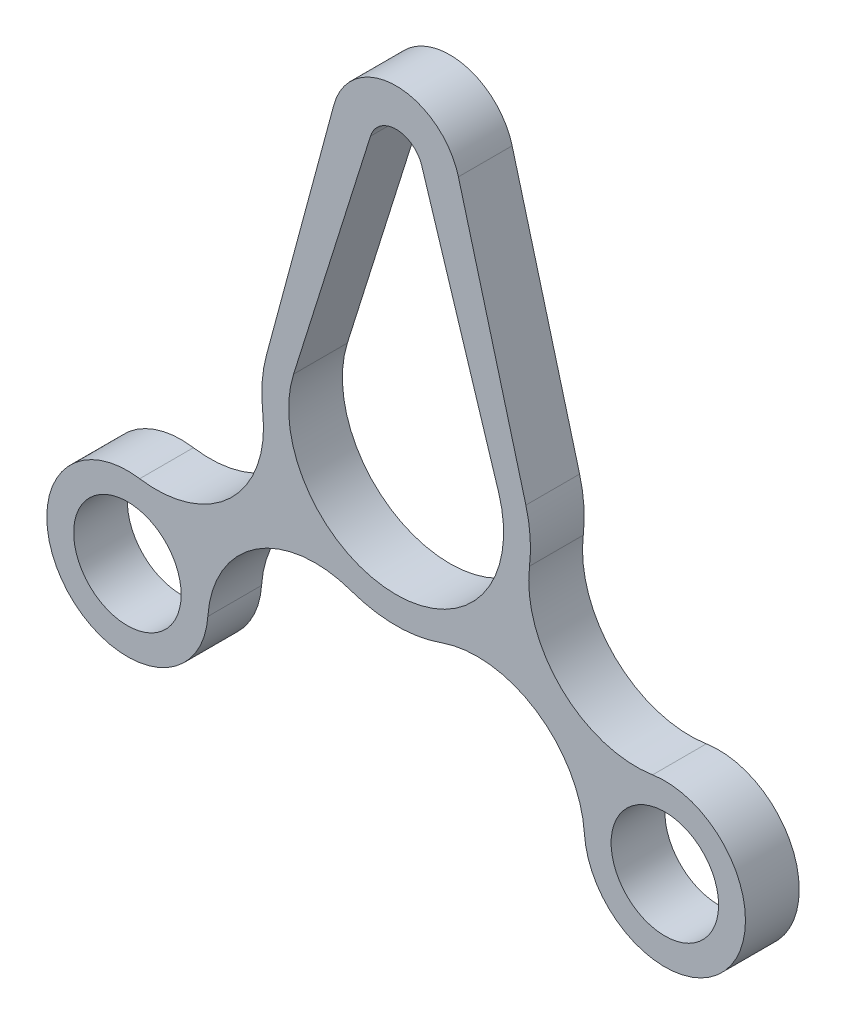
ISO-10303-21;
HEADER;
FILE_DESCRIPTION(('STEP AP214'),'2;1');
FILE_NAME('part.step','',(''),(''),'','','');
FILE_SCHEMA(('AUTOMOTIVE_DESIGN { 1 0 10303 214 1 1 1 1 }'));
ENDSEC;
DATA;
#1=APPLICATION_CONTEXT('core data for automotive mechanical design processes');
#2=APPLICATION_PROTOCOL_DEFINITION('international standard','automotive_design',2000,#1);
#3=PRODUCT_CONTEXT('',#1,'mechanical');
#4=PRODUCT('Part','Part','',(#3));
#5=PRODUCT_RELATED_PRODUCT_CATEGORY('part','',(#4));
#6=PRODUCT_DEFINITION_FORMATION('','',#4);
#7=PRODUCT_DEFINITION_CONTEXT('part definition',#1,'design');
#8=PRODUCT_DEFINITION('design','',#6,#7);
#9=PRODUCT_DEFINITION_SHAPE('','',#8);
#10=(LENGTH_UNIT() NAMED_UNIT(*) SI_UNIT(.MILLI.,.METRE.));
#11=(NAMED_UNIT(*) PLANE_ANGLE_UNIT() SI_UNIT($,.RADIAN.));
#12=(NAMED_UNIT(*) SI_UNIT($,.STERADIAN.) SOLID_ANGLE_UNIT());
#13=UNCERTAINTY_MEASURE_WITH_UNIT(LENGTH_MEASURE(1.E-05),#10,'distance_accuracy_value','');
#14=(GEOMETRIC_REPRESENTATION_CONTEXT(3) GLOBAL_UNCERTAINTY_ASSIGNED_CONTEXT((#13)) GLOBAL_UNIT_ASSIGNED_CONTEXT((#10,
#11,#12)) REPRESENTATION_CONTEXT('',''));
#15=CARTESIAN_POINT('',(0.,0.,0.));
#16=DIRECTION('',(0.,0.,1.));
#17=DIRECTION('',(1.,0.,0.));
#18=AXIS2_PLACEMENT_3D('',#15,#16,#17);
#19=CARTESIAN_POINT('',(44.6739033054664,-5.40762086816695,10.));
#20=DIRECTION('',(0.,0.,-1.));
#21=DIRECTION('',(-1.,0.,0.));
#22=AXIS2_PLACEMENT_3D('',#19,#20,#21);
#23=CYLINDRICAL_SURFACE('',#22,20.);
#24=CARTESIAN_POINT('',(44.6739033054664,-5.40762086816695,0.));
#25=DIRECTION('',(0.,0.,1.));
#26=DIRECTION('',(1.,0.,0.));
#27=AXIS2_PLACEMENT_3D('',#24,#25,#26);
#28=CIRCLE('',#27,20.);
#29=CARTESIAN_POINT('',(47.7173871309142,-25.1746946577858,0.));
#30=VERTEX_POINT('',#29);
#31=CARTESIAN_POINT('',(24.8188351697036,-3.00423381564831,0.));
#32=VERTEX_POINT('',#31);
#33=EDGE_CURVE('E208',#30,#32,#28,.F.);
#34=ORIENTED_EDGE('',*,*,#33,.T.);
#35=DIRECTION('',(0.,0.,-1.));
#36=VECTOR('',#35,1.);
#37=CARTESIAN_POINT('',(24.8188351697036,-3.00423381564831,10.));
#38=LINE('',#37,#36);
#39=CARTESIAN_POINT('',(24.8188351697036,-3.00423381564831,10.));
#40=VERTEX_POINT('',#39);
#41=EDGE_CURVE('E11',#40,#32,#38,.T.);
#42=ORIENTED_EDGE('',*,*,#41,.F.);
#43=CARTESIAN_POINT('',(44.6739033054664,-5.40762086816695,10.));
#44=DIRECTION('',(0.,0.,1.));
#45=DIRECTION('',(1.,0.,0.));
#46=AXIS2_PLACEMENT_3D('',#43,#44,#45);
#47=CIRCLE('',#46,20.);
#48=CARTESIAN_POINT('',(47.7173871309142,-25.1746946577858,10.));
#49=VERTEX_POINT('',#48);
#50=EDGE_CURVE('E287',#49,#40,#47,.F.);
#51=ORIENTED_EDGE('',*,*,#50,.F.);
#52=DIRECTION('',(0.,0.,-1.));
#53=VECTOR('',#52,1.);
#54=CARTESIAN_POINT('',(47.7173871309142,-25.1746946577858,10.));
#55=LINE('',#54,#53);
#56=EDGE_CURVE('E58',#49,#30,#55,.T.);
#57=ORIENTED_EDGE('',*,*,#56,.T.);
#58=EDGE_LOOP('',(#34,#42,#51,#57));
#59=FACE_BOUND('',#58,.T.);
#60=ADVANCED_FACE('F39',(#59),#23,.F.);
#61=CARTESIAN_POINT('',(0.,0.,10.));
#62=DIRECTION('',(0.,0.,-1.));
#63=DIRECTION('',(-1.,0.,0.));
#64=AXIS2_PLACEMENT_3D('',#61,#62,#63);
#65=CYLINDRICAL_SURFACE('',#64,25.);
#66=CARTESIAN_POINT('',(0.,0.,0.));
#67=DIRECTION('',(0.,0.,1.));
#68=DIRECTION('',(1.,0.,0.));
#69=AXIS2_PLACEMENT_3D('',#66,#67,#68);
#70=CIRCLE('',#69,25.);
#71=CARTESIAN_POINT('',(24.1402154091466,6.5,0.));
#72=VERTEX_POINT('',#71);
#73=EDGE_CURVE('E210',#32,#72,#70,.T.);
#74=ORIENTED_EDGE('',*,*,#73,.T.);
#75=DIRECTION('',(0.,0.,-1.));
#76=VECTOR('',#75,1.);
#77=CARTESIAN_POINT('',(24.1402154091466,6.5,10.));
#78=LINE('',#77,#76);
#79=CARTESIAN_POINT('',(24.1402154091466,6.5,10.));
#80=VERTEX_POINT('',#79);
#81=EDGE_CURVE('E49',#80,#72,#78,.T.);
#82=ORIENTED_EDGE('',*,*,#81,.F.);
#83=CARTESIAN_POINT('',(0.,0.,10.));
#84=DIRECTION('',(0.,0.,1.));
#85=DIRECTION('',(1.,0.,0.));
#86=AXIS2_PLACEMENT_3D('',#83,#84,#85);
#87=CIRCLE('',#86,25.);
#88=EDGE_CURVE('E294',#40,#80,#87,.T.);
#89=ORIENTED_EDGE('',*,*,#88,.F.);
#90=ORIENTED_EDGE('',*,*,#41,.T.);
#91=EDGE_LOOP('',(#74,#82,#89,#90));
#92=FACE_BOUND('',#91,.T.);
#93=ADVANCED_FACE('F333',(#92),#65,.T.);
#94=CARTESIAN_POINT('',(24.1402154091466,6.5,10.));
#95=DIRECTION('',(-0.965608616365865,-0.26,0.));
#96=DIRECTION('',(0.26,-0.965608616365865,0.));
#97=AXIS2_PLACEMENT_3D('',#94,#95,#96);
#98=PLANE('',#97);
#99=DIRECTION('',(-0.26,0.965608616365865,0.));
#100=VECTOR('',#99,1.);
#101=CARTESIAN_POINT('',(24.1402154091466,6.5,0.));
#102=LINE('',#101,#100);
#103=CARTESIAN_POINT('',(11.5873033963904,53.12,0.));
#104=VERTEX_POINT('',#103);
#105=EDGE_CURVE('E212',#72,#104,#102,.T.);
#106=ORIENTED_EDGE('',*,*,#105,.T.);
#107=DIRECTION('',(0.,0.,-1.));
#108=VECTOR('',#107,1.);
#109=CARTESIAN_POINT('',(11.5873033963904,53.12,10.));
#110=LINE('',#109,#108);
#111=CARTESIAN_POINT('',(11.5873033963904,53.12,10.));
#112=VERTEX_POINT('',#111);
#113=EDGE_CURVE('E257',#112,#104,#110,.T.);
#114=ORIENTED_EDGE('',*,*,#113,.F.);
#115=DIRECTION('',(-0.26,0.965608616365865,0.));
#116=VECTOR('',#115,1.);
#117=CARTESIAN_POINT('',(24.1402154091466,6.5,10.));
#118=LINE('',#117,#116);
#119=EDGE_CURVE('E296',#80,#112,#118,.T.);
#120=ORIENTED_EDGE('',*,*,#119,.F.);
#121=ORIENTED_EDGE('',*,*,#81,.T.);
#122=EDGE_LOOP('',(#106,#114,#120,#121));
#123=FACE_BOUND('',#122,.T.);
#124=ADVANCED_FACE('F338',(#123),#98,.F.);
#125=CARTESIAN_POINT('',(0.,50.,10.));
#126=DIRECTION('',(0.,0.,-1.));
#127=DIRECTION('',(-1.,0.,0.));
#128=AXIS2_PLACEMENT_3D('',#125,#126,#127);
#129=CYLINDRICAL_SURFACE('',#128,12.);
#130=CARTESIAN_POINT('',(0.,50.,0.));
#131=DIRECTION('',(0.,0.,1.));
#132=DIRECTION('',(1.,0.,0.));
#133=AXIS2_PLACEMENT_3D('',#130,#131,#132);
#134=CIRCLE('',#133,12.);
#135=CARTESIAN_POINT('',(-11.5873033963904,53.12,0.));
#136=VERTEX_POINT('',#135);
#137=EDGE_CURVE('E214',#104,#136,#134,.T.);
#138=ORIENTED_EDGE('',*,*,#137,.T.);
#139=DIRECTION('',(0.,0.,-1.));
#140=VECTOR('',#139,1.);
#141=CARTESIAN_POINT('',(-11.5873033963904,53.12,10.));
#142=LINE('',#141,#140);
#143=CARTESIAN_POINT('',(-11.5873033963904,53.12,10.));
#144=VERTEX_POINT('',#143);
#145=EDGE_CURVE('E255',#144,#136,#142,.T.);
#146=ORIENTED_EDGE('',*,*,#145,.F.);
#147=CARTESIAN_POINT('',(0.,50.,10.));
#148=DIRECTION('',(0.,0.,1.));
#149=DIRECTION('',(1.,0.,0.));
#150=AXIS2_PLACEMENT_3D('',#147,#148,#149);
#151=CIRCLE('',#150,12.);
#152=EDGE_CURVE('E298',#112,#144,#151,.T.);
#153=ORIENTED_EDGE('',*,*,#152,.F.);
#154=ORIENTED_EDGE('',*,*,#113,.T.);
#155=EDGE_LOOP('',(#138,#146,#153,#154));
#156=FACE_BOUND('',#155,.T.);
#157=ADVANCED_FACE('F371',(#156),#129,.T.);
#158=CARTESIAN_POINT('',(-24.1402154091466,6.5,10.));
#159=DIRECTION('',(-0.965608616365865,0.26,0.));
#160=DIRECTION('',(-0.26,-0.965608616365865,0.));
#161=AXIS2_PLACEMENT_3D('',#158,#159,#160);
#162=PLANE('',#161);
#163=DIRECTION('',(0.26,0.965608616365865,0.));
#164=VECTOR('',#163,1.);
#165=CARTESIAN_POINT('',(-24.1402154091466,6.5,0.));
#166=LINE('',#165,#164);
#167=CARTESIAN_POINT('',(-24.1402154091466,6.5,0.));
#168=VERTEX_POINT('',#167);
#169=EDGE_CURVE('E217',#168,#136,#166,.T.);
#170=ORIENTED_EDGE('',*,*,#169,.F.);
#171=DIRECTION('',(0.,0.,-1.));
#172=VECTOR('',#171,1.);
#173=CARTESIAN_POINT('',(-24.1402154091466,6.5,10.));
#174=LINE('',#173,#172);
#175=CARTESIAN_POINT('',(-24.1402154091466,6.5,10.));
#176=VERTEX_POINT('',#175);
#177=EDGE_CURVE('E253',#176,#168,#174,.T.);
#178=ORIENTED_EDGE('',*,*,#177,.F.);
#179=DIRECTION('',(0.26,0.965608616365865,0.));
#180=VECTOR('',#179,1.);
#181=CARTESIAN_POINT('',(-24.1402154091466,6.5,10.));
#182=LINE('',#181,#180);
#183=EDGE_CURVE('E300',#176,#144,#182,.T.);
#184=ORIENTED_EDGE('',*,*,#183,.T.);
#185=ORIENTED_EDGE('',*,*,#145,.T.);
#186=EDGE_LOOP('',(#170,#178,#184,#185));
#187=FACE_BOUND('',#186,.T.);
#188=ADVANCED_FACE('F367',(#187),#162,.T.);
#189=CARTESIAN_POINT('',(0.,0.,10.));
#190=DIRECTION('',(0.,0.,-1.));
#191=DIRECTION('',(-1.,0.,0.));
#192=AXIS2_PLACEMENT_3D('',#189,#190,#191);
#193=CYLINDRICAL_SURFACE('',#192,25.);
#194=CARTESIAN_POINT('',(0.,0.,0.));
#195=DIRECTION('',(0.,0.,1.));
#196=DIRECTION('',(1.,0.,0.));
#197=AXIS2_PLACEMENT_3D('',#194,#195,#196);
#198=CIRCLE('',#197,25.);
#199=CARTESIAN_POINT('',(-24.8188351697036,-3.0042338156483,0.));
#200=VERTEX_POINT('',#199);
#201=EDGE_CURVE('E220',#168,#200,#198,.T.);
#202=ORIENTED_EDGE('',*,*,#201,.T.);
#203=DIRECTION('',(0.,0.,-1.));
#204=VECTOR('',#203,1.);
#205=CARTESIAN_POINT('',(-24.8188351697036,-3.0042338156483,10.));
#206=LINE('',#205,#204);
#207=CARTESIAN_POINT('',(-24.8188351697036,-3.0042338156483,10.));
#208=VERTEX_POINT('',#207);
#209=EDGE_CURVE('E251',#208,#200,#206,.T.);
#210=ORIENTED_EDGE('',*,*,#209,.F.);
#211=CARTESIAN_POINT('',(0.,0.,10.));
#212=DIRECTION('',(0.,0.,1.));
#213=DIRECTION('',(1.,0.,0.));
#214=AXIS2_PLACEMENT_3D('',#211,#212,#213);
#215=CIRCLE('',#214,25.);
#216=EDGE_CURVE('E303',#176,#208,#215,.T.);
#217=ORIENTED_EDGE('',*,*,#216,.F.);
#218=ORIENTED_EDGE('',*,*,#177,.T.);
#219=EDGE_LOOP('',(#202,#210,#217,#218));
#220=FACE_BOUND('',#219,.T.);
#221=ADVANCED_FACE('F363',(#220),#193,.T.);
#222=CARTESIAN_POINT('',(-44.6739033054664,-5.40762086816695,10.));
#223=DIRECTION('',(0.,0.,-1.));
#224=DIRECTION('',(-1.,0.,0.));
#225=AXIS2_PLACEMENT_3D('',#222,#223,#224);
#226=CYLINDRICAL_SURFACE('',#225,20.);
#227=CARTESIAN_POINT('',(-44.6739033054664,-5.40762086816695,0.));
#228=DIRECTION('',(0.,0.,1.));
#229=DIRECTION('',(1.,0.,0.));
#230=AXIS2_PLACEMENT_3D('',#227,#228,#229);
#231=CIRCLE('',#230,20.);
#232=CARTESIAN_POINT('',(-47.7173871309142,-25.1746946577858,0.));
#233=VERTEX_POINT('',#232);
#234=EDGE_CURVE('E223',#233,#200,#231,.T.);
#235=ORIENTED_EDGE('',*,*,#234,.F.);
#236=DIRECTION('',(0.,0.,-1.));
#237=VECTOR('',#236,1.);
#238=CARTESIAN_POINT('',(-47.7173871309142,-25.1746946577858,10.));
#239=LINE('',#238,#237);
#240=CARTESIAN_POINT('',(-47.7173871309142,-25.1746946577858,10.));
#241=VERTEX_POINT('',#240);
#242=EDGE_CURVE('E249',#241,#233,#239,.T.);
#243=ORIENTED_EDGE('',*,*,#242,.F.);
#244=CARTESIAN_POINT('',(-44.6739033054664,-5.40762086816695,10.));
#245=DIRECTION('',(0.,0.,1.));
#246=DIRECTION('',(1.,0.,0.));
#247=AXIS2_PLACEMENT_3D('',#244,#245,#246);
#248=CIRCLE('',#247,20.);
#249=EDGE_CURVE('E305',#241,#208,#248,.T.);
#250=ORIENTED_EDGE('',*,*,#249,.T.);
#251=ORIENTED_EDGE('',*,*,#209,.T.);
#252=EDGE_LOOP('',(#235,#243,#250,#251));
#253=FACE_BOUND('',#252,.T.);
#254=ADVANCED_FACE('F360',(#253),#226,.F.);
#255=CARTESIAN_POINT('',(-50.,-40.,10.));
#256=DIRECTION('',(0.,0.,-1.));
#257=DIRECTION('',(-1.,0.,0.));
#258=AXIS2_PLACEMENT_3D('',#255,#256,#257);
#259=CYLINDRICAL_SURFACE('',#258,15.);
#260=CARTESIAN_POINT('',(-50.,-40.,0.));
#261=DIRECTION('',(0.,0.,1.));
#262=DIRECTION('',(1.,0.,0.));
#263=AXIS2_PLACEMENT_3D('',#260,#261,#262);
#264=CIRCLE('',#263,15.);
#265=CARTESIAN_POINT('',(-35.0352261095039,-41.0273959345487,0.));
#266=VERTEX_POINT('',#265);
#267=EDGE_CURVE('E226',#233,#266,#264,.T.);
#268=ORIENTED_EDGE('',*,*,#267,.T.);
#269=DIRECTION('',(0.,0.,-1.));
#270=VECTOR('',#269,1.);
#271=CARTESIAN_POINT('',(-35.0352261095039,-41.0273959345487,10.));
#272=LINE('',#271,#270);
#273=CARTESIAN_POINT('',(-35.0352261095039,-41.0273959345487,10.));
#274=VERTEX_POINT('',#273);
#275=EDGE_CURVE('E246',#274,#266,#272,.T.);
#276=ORIENTED_EDGE('',*,*,#275,.F.);
#277=CARTESIAN_POINT('',(-50.,-40.,10.));
#278=DIRECTION('',(0.,0.,1.));
#279=DIRECTION('',(1.,0.,0.));
#280=AXIS2_PLACEMENT_3D('',#277,#278,#279);
#281=CIRCLE('',#280,15.);
#282=EDGE_CURVE('E308',#241,#274,#281,.T.);
#283=ORIENTED_EDGE('',*,*,#282,.F.);
#284=ORIENTED_EDGE('',*,*,#242,.T.);
#285=EDGE_LOOP('',(#268,#276,#283,#284));
#286=FACE_BOUND('',#285,.T.);
#287=ADVANCED_FACE('F313',(#286),#259,.T.);
#288=CARTESIAN_POINT('',(-15.0821942555092,-42.3972571806135,10.));
#289=DIRECTION('',(0.,0.,-1.));
#290=DIRECTION('',(-1.,0.,0.));
#291=AXIS2_PLACEMENT_3D('',#288,#289,#290);
#292=CYLINDRICAL_SURFACE('',#291,20.);
#293=CARTESIAN_POINT('',(-15.0821942555092,-42.3972571806135,0.));
#294=DIRECTION('',(0.,0.,1.));
#295=DIRECTION('',(1.,0.,0.));
#296=AXIS2_PLACEMENT_3D('',#293,#294,#295);
#297=CIRCLE('',#296,20.);
#298=CARTESIAN_POINT('',(-8.3789968086162,-23.5540317670075,0.));
#299=VERTEX_POINT('',#298);
#300=EDGE_CURVE('E228',#266,#299,#297,.F.);
#301=ORIENTED_EDGE('',*,*,#300,.T.);
#302=DIRECTION('',(0.,0.,-1.));
#303=VECTOR('',#302,1.);
#304=CARTESIAN_POINT('',(-8.3789968086162,-23.5540317670075,10.));
#305=LINE('',#304,#303);
#306=CARTESIAN_POINT('',(-8.3789968086162,-23.5540317670075,10.));
#307=VERTEX_POINT('',#306);
#308=EDGE_CURVE('E181',#307,#299,#305,.T.);
#309=ORIENTED_EDGE('',*,*,#308,.F.);
#310=CARTESIAN_POINT('',(-15.0821942555092,-42.3972571806135,10.));
#311=DIRECTION('',(0.,0.,1.));
#312=DIRECTION('',(1.,0.,0.));
#313=AXIS2_PLACEMENT_3D('',#310,#311,#312);
#314=CIRCLE('',#313,20.);
#315=EDGE_CURVE('E169',#274,#307,#314,.F.);
#316=ORIENTED_EDGE('',*,*,#315,.F.);
#317=ORIENTED_EDGE('',*,*,#275,.T.);
#318=EDGE_LOOP('',(#301,#309,#316,#317));
#319=FACE_BOUND('',#318,.T.);
#320=ADVANCED_FACE('F317',(#319),#292,.F.);
#321=CARTESIAN_POINT('',(0.,0.,10.));
#322=DIRECTION('',(0.,0.,-1.));
#323=DIRECTION('',(-1.,0.,0.));
#324=AXIS2_PLACEMENT_3D('',#321,#322,#323);
#325=CYLINDRICAL_SURFACE('',#324,25.);
#326=CARTESIAN_POINT('',(0.,0.,0.));
#327=DIRECTION('',(0.,0.,1.));
#328=DIRECTION('',(1.,0.,0.));
#329=AXIS2_PLACEMENT_3D('',#326,#327,#328);
#330=CIRCLE('',#329,25.);
#331=CARTESIAN_POINT('',(8.3789968086162,-23.5540317670075,0.));
#332=VERTEX_POINT('',#331);
#333=EDGE_CURVE('E178',#299,#332,#330,.T.);
#334=ORIENTED_EDGE('',*,*,#333,.T.);
#335=DIRECTION('',(0.,0.,-1.));
#336=VECTOR('',#335,1.);
#337=CARTESIAN_POINT('',(8.3789968086162,-23.5540317670075,10.));
#338=LINE('',#337,#336);
#339=CARTESIAN_POINT('',(8.3789968086162,-23.5540317670075,10.));
#340=VERTEX_POINT('',#339);
#341=EDGE_CURVE('E175',#340,#332,#338,.T.);
#342=ORIENTED_EDGE('',*,*,#341,.F.);
#343=CARTESIAN_POINT('',(0.,0.,10.));
#344=DIRECTION('',(0.,0.,1.));
#345=DIRECTION('',(1.,0.,0.));
#346=AXIS2_PLACEMENT_3D('',#343,#344,#345);
#347=CIRCLE('',#346,25.);
#348=EDGE_CURVE('E160',#307,#340,#347,.T.);
#349=ORIENTED_EDGE('',*,*,#348,.F.);
#350=ORIENTED_EDGE('',*,*,#308,.T.);
#351=EDGE_LOOP('',(#334,#342,#349,#350));
#352=FACE_BOUND('',#351,.T.);
#353=ADVANCED_FACE('F176',(#352),#325,.T.);
#354=CARTESIAN_POINT('',(15.0821942555092,-42.3972571806135,10.));
#355=DIRECTION('',(0.,0.,-1.));
#356=DIRECTION('',(-1.,0.,0.));
#357=AXIS2_PLACEMENT_3D('',#354,#355,#356);
#358=CYLINDRICAL_SURFACE('',#357,20.);
#359=CARTESIAN_POINT('',(15.0821942555092,-42.3972571806135,0.));
#360=DIRECTION('',(0.,0.,1.));
#361=DIRECTION('',(1.,0.,0.));
#362=AXIS2_PLACEMENT_3D('',#359,#360,#361);
#363=CIRCLE('',#362,20.);
#364=CARTESIAN_POINT('',(35.0352261095039,-41.0273959345487,0.));
#365=VERTEX_POINT('',#364);
#366=EDGE_CURVE('E231',#365,#332,#363,.T.);
#367=ORIENTED_EDGE('',*,*,#366,.F.);
#368=DIRECTION('',(0.,0.,-1.));
#369=VECTOR('',#368,1.);
#370=CARTESIAN_POINT('',(35.0352261095039,-41.0273959345487,10.));
#371=LINE('',#370,#369);
#372=CARTESIAN_POINT('',(35.0352261095039,-41.0273959345487,10.));
#373=VERTEX_POINT('',#372);
#374=EDGE_CURVE('E108',#373,#365,#371,.T.);
#375=ORIENTED_EDGE('',*,*,#374,.F.);
#376=CARTESIAN_POINT('',(15.0821942555092,-42.3972571806135,10.));
#377=DIRECTION('',(0.,0.,1.));
#378=DIRECTION('',(1.,0.,0.));
#379=AXIS2_PLACEMENT_3D('',#376,#377,#378);
#380=CIRCLE('',#379,20.);
#381=EDGE_CURVE('E167',#373,#340,#380,.T.);
#382=ORIENTED_EDGE('',*,*,#381,.T.);
#383=ORIENTED_EDGE('',*,*,#341,.T.);
#384=EDGE_LOOP('',(#367,#375,#382,#383));
#385=FACE_BOUND('',#384,.T.);
#386=ADVANCED_FACE('F183',(#385),#358,.F.);
#387=CARTESIAN_POINT('',(0.,50.,10.));
#388=DIRECTION('',(0.,0.,-1.));
#389=DIRECTION('',(-1.,0.,0.));
#390=AXIS2_PLACEMENT_3D('',#387,#388,#389);
#391=CYLINDRICAL_SURFACE('',#390,5.);
#392=CARTESIAN_POINT('',(0.,50.,0.));
#393=DIRECTION('',(0.,0.,1.));
#394=DIRECTION('',(1.,0.,0.));
#395=AXIS2_PLACEMENT_3D('',#392,#393,#394);
#396=CIRCLE('',#395,5.);
#397=CARTESIAN_POINT('',(4.76969600708474,51.5,0.));
#398=VERTEX_POINT('',#397);
#399=CARTESIAN_POINT('',(-4.76969600708474,51.5,0.));
#400=VERTEX_POINT('',#399);
#401=EDGE_CURVE('E196',#398,#400,#396,.T.);
#402=ORIENTED_EDGE('',*,*,#401,.F.);
#403=DIRECTION('',(0.,0.,-1.));
#404=VECTOR('',#403,1.);
#405=CARTESIAN_POINT('',(4.76969600708474,51.5,10.));
#406=LINE('',#405,#404);
#407=CARTESIAN_POINT('',(4.76969600708474,51.5,10.));
#408=VERTEX_POINT('',#407);
#409=EDGE_CURVE('E43',#408,#398,#406,.T.);
#410=ORIENTED_EDGE('',*,*,#409,.F.);
#411=CARTESIAN_POINT('',(0.,50.,10.));
#412=DIRECTION('',(0.,0.,1.));
#413=DIRECTION('',(1.,0.,0.));
#414=AXIS2_PLACEMENT_3D('',#411,#412,#413);
#415=CIRCLE('',#414,5.);
#416=CARTESIAN_POINT('',(-4.76969600708474,51.5,10.));
#417=VERTEX_POINT('',#416);
#418=EDGE_CURVE('E242',#408,#417,#415,.T.);
#419=ORIENTED_EDGE('',*,*,#418,.T.);
#420=DIRECTION('',(0.,0.,-1.));
#421=VECTOR('',#420,1.);
#422=CARTESIAN_POINT('',(-4.76969600708474,51.5,10.));
#423=LINE('',#422,#421);
#424=EDGE_CURVE('E195',#417,#400,#423,.T.);
#425=ORIENTED_EDGE('',*,*,#424,.T.);
#426=EDGE_LOOP('',(#402,#410,#419,#425));
#427=FACE_BOUND('',#426,.T.);
#428=ADVANCED_FACE('F41',(#427),#391,.F.);
#429=CARTESIAN_POINT('',(19.0787840283389,6.,10.));
#430=DIRECTION('',(-0.953939201416946,-0.3,0.));
#431=DIRECTION('',(0.3,-0.953939201416946,0.));
#432=AXIS2_PLACEMENT_3D('',#429,#430,#431);
#433=PLANE('',#432);
#434=DIRECTION('',(-0.3,0.953939201416946,0.));
#435=VECTOR('',#434,1.);
#436=CARTESIAN_POINT('',(19.0787840283389,6.,0.));
#437=LINE('',#436,#435);
#438=CARTESIAN_POINT('',(19.0787840283389,6.,0.));
#439=VERTEX_POINT('',#438);
#440=EDGE_CURVE('E199',#439,#398,#437,.T.);
#441=ORIENTED_EDGE('',*,*,#440,.F.);
#442=DIRECTION('',(0.,0.,-1.));
#443=VECTOR('',#442,1.);
#444=CARTESIAN_POINT('',(19.0787840283389,6.,10.));
#445=LINE('',#444,#443);
#446=CARTESIAN_POINT('',(19.0787840283389,6.,10.));
#447=VERTEX_POINT('',#446);
#448=EDGE_CURVE('E264',#447,#439,#445,.T.);
#449=ORIENTED_EDGE('',*,*,#448,.F.);
#450=DIRECTION('',(-0.3,0.953939201416946,0.));
#451=VECTOR('',#450,1.);
#452=CARTESIAN_POINT('',(19.0787840283389,6.,10.));
#453=LINE('',#452,#451);
#454=EDGE_CURVE('E273',#447,#408,#453,.T.);
#455=ORIENTED_EDGE('',*,*,#454,.T.);
#456=ORIENTED_EDGE('',*,*,#409,.T.);
#457=EDGE_LOOP('',(#441,#449,#455,#456));
#458=FACE_BOUND('',#457,.T.);
#459=ADVANCED_FACE('F271',(#458),#433,.T.);
#460=CARTESIAN_POINT('',(0.,0.,10.));
#461=DIRECTION('',(0.,0.,-1.));
#462=DIRECTION('',(-1.,0.,0.));
#463=AXIS2_PLACEMENT_3D('',#460,#461,#462);
#464=CYLINDRICAL_SURFACE('',#463,20.);
#465=CARTESIAN_POINT('',(0.,0.,0.));
#466=DIRECTION('',(0.,0.,1.));
#467=DIRECTION('',(1.,0.,0.));
#468=AXIS2_PLACEMENT_3D('',#465,#466,#467);
#469=CIRCLE('',#468,20.);
#470=CARTESIAN_POINT('',(-19.0787840283389,6.,0.));
#471=VERTEX_POINT('',#470);
#472=EDGE_CURVE('E202',#471,#439,#469,.T.);
#473=ORIENTED_EDGE('',*,*,#472,.F.);
#474=DIRECTION('',(0.,0.,-1.));
#475=VECTOR('',#474,1.);
#476=CARTESIAN_POINT('',(-19.0787840283389,6.,10.));
#477=LINE('',#476,#475);
#478=CARTESIAN_POINT('',(-19.0787840283389,6.,10.));
#479=VERTEX_POINT('',#478);
#480=EDGE_CURVE('E263',#479,#471,#477,.T.);
#481=ORIENTED_EDGE('',*,*,#480,.F.);
#482=CARTESIAN_POINT('',(0.,0.,10.));
#483=DIRECTION('',(0.,0.,1.));
#484=DIRECTION('',(1.,0.,0.));
#485=AXIS2_PLACEMENT_3D('',#482,#483,#484);
#486=CIRCLE('',#485,20.);
#487=EDGE_CURVE('E282',#479,#447,#486,.T.);
#488=ORIENTED_EDGE('',*,*,#487,.T.);
#489=ORIENTED_EDGE('',*,*,#448,.T.);
#490=EDGE_LOOP('',(#473,#481,#488,#489));
#491=FACE_BOUND('',#490,.T.);
#492=ADVANCED_FACE('F279',(#491),#464,.F.);
#493=CARTESIAN_POINT('',(50.,-40.,10.));
#494=DIRECTION('',(0.,0.,-1.));
#495=DIRECTION('',(-1.,0.,0.));
#496=AXIS2_PLACEMENT_3D('',#493,#494,#495);
#497=CYLINDRICAL_SURFACE('',#496,10.);
#498=CARTESIAN_POINT('',(50.,-40.,10.));
#499=DIRECTION('',(0.,0.,1.));
#500=DIRECTION('',(1.,0.,0.));
#501=AXIS2_PLACEMENT_3D('',#498,#499,#500);
#502=CIRCLE('',#501,10.);
#503=CARTESIAN_POINT('',(60.,-40.,10.));
#504=VERTEX_POINT('',#503);
#505=EDGE_CURVE('E186',#504,#504,#502,.F.);
#506=ORIENTED_EDGE('',*,*,#505,.F.);
#507=EDGE_LOOP('',(#506));
#508=FACE_BOUND('',#507,.T.);
#509=CARTESIAN_POINT('',(50.,-40.,0.));
#510=DIRECTION('',(0.,0.,1.));
#511=DIRECTION('',(1.,0.,0.));
#512=AXIS2_PLACEMENT_3D('',#509,#510,#511);
#513=CIRCLE('',#512,10.);
#514=CARTESIAN_POINT('',(60.,-40.,0.));
#515=VERTEX_POINT('',#514);
#516=EDGE_CURVE('E236',#515,#515,#513,.F.);
#517=ORIENTED_EDGE('',*,*,#516,.T.);
#518=EDGE_LOOP('',(#517));
#519=FACE_BOUND('',#518,.T.);
#520=ADVANCED_FACE('F321',(#508,#519),#497,.F.);
#521=CARTESIAN_POINT('',(50.,-40.,10.));
#522=DIRECTION('',(0.,0.,-1.));
#523=DIRECTION('',(-1.,0.,0.));
#524=AXIS2_PLACEMENT_3D('',#521,#522,#523);
#525=CYLINDRICAL_SURFACE('',#524,15.);
#526=CARTESIAN_POINT('',(50.,-40.,0.));
#527=DIRECTION('',(0.,0.,1.));
#528=DIRECTION('',(1.,0.,0.));
#529=AXIS2_PLACEMENT_3D('',#526,#527,#528);
#530=CIRCLE('',#529,15.);
#531=EDGE_CURVE('E233',#30,#365,#530,.F.);
#532=ORIENTED_EDGE('',*,*,#531,.F.);
#533=ORIENTED_EDGE('',*,*,#56,.F.);
#534=CARTESIAN_POINT('',(50.,-40.,10.));
#535=DIRECTION('',(0.,0.,1.));
#536=DIRECTION('',(1.,0.,0.));
#537=AXIS2_PLACEMENT_3D('',#534,#535,#536);
#538=CIRCLE('',#537,15.);
#539=EDGE_CURVE('E184',#49,#373,#538,.F.);
#540=ORIENTED_EDGE('',*,*,#539,.T.);
#541=ORIENTED_EDGE('',*,*,#374,.T.);
#542=EDGE_LOOP('',(#532,#533,#540,#541));
#543=FACE_BOUND('',#542,.T.);
#544=ADVANCED_FACE('F319',(#543),#525,.T.);
#545=CARTESIAN_POINT('',(-19.0787840283389,6.,10.));
#546=DIRECTION('',(-0.953939201416946,0.3,0.));
#547=DIRECTION('',(-0.3,-0.953939201416946,0.));
#548=AXIS2_PLACEMENT_3D('',#545,#546,#547);
#549=PLANE('',#548);
#550=DIRECTION('',(0.3,0.953939201416946,0.));
#551=VECTOR('',#550,1.);
#552=CARTESIAN_POINT('',(-19.0787840283389,6.,0.));
#553=LINE('',#552,#551);
#554=EDGE_CURVE('E205',#471,#400,#553,.T.);
#555=ORIENTED_EDGE('',*,*,#554,.T.);
#556=ORIENTED_EDGE('',*,*,#424,.F.);
#557=DIRECTION('',(0.3,0.953939201416946,0.));
#558=VECTOR('',#557,1.);
#559=CARTESIAN_POINT('',(-19.0787840283389,6.,10.));
#560=LINE('',#559,#558);
#561=EDGE_CURVE('E284',#479,#417,#560,.T.);
#562=ORIENTED_EDGE('',*,*,#561,.F.);
#563=ORIENTED_EDGE('',*,*,#480,.T.);
#564=EDGE_LOOP('',(#555,#556,#562,#563));
#565=FACE_BOUND('',#564,.T.);
#566=ADVANCED_FACE('F285',(#565),#549,.F.);
#567=CARTESIAN_POINT('',(-50.,-40.,10.));
#568=DIRECTION('',(0.,0.,-1.));
#569=DIRECTION('',(-1.,0.,0.));
#570=AXIS2_PLACEMENT_3D('',#567,#568,#569);
#571=CYLINDRICAL_SURFACE('',#570,10.);
#572=CARTESIAN_POINT('',(-50.,-40.,10.));
#573=DIRECTION('',(0.,0.,1.));
#574=DIRECTION('',(1.,0.,0.));
#575=AXIS2_PLACEMENT_3D('',#572,#573,#574);
#576=CIRCLE('',#575,10.);
#577=CARTESIAN_POINT('',(-40.,-40.,10.));
#578=VERTEX_POINT('',#577);
#579=EDGE_CURVE('E192',#578,#578,#576,.T.);
#580=ORIENTED_EDGE('',*,*,#579,.T.);
#581=EDGE_LOOP('',(#580));
#582=FACE_BOUND('',#581,.T.);
#583=CARTESIAN_POINT('',(-50.,-40.,0.));
#584=DIRECTION('',(0.,0.,1.));
#585=DIRECTION('',(1.,0.,0.));
#586=AXIS2_PLACEMENT_3D('',#583,#584,#585);
#587=CIRCLE('',#586,10.);
#588=CARTESIAN_POINT('',(-40.,-40.,0.));
#589=VERTEX_POINT('',#588);
#590=EDGE_CURVE('E239',#589,#589,#587,.T.);
#591=ORIENTED_EDGE('',*,*,#590,.F.);
#592=EDGE_LOOP('',(#591));
#593=FACE_BOUND('',#592,.T.);
#594=ADVANCED_FACE('F327',(#582,#593),#571,.F.);
#595=CARTESIAN_POINT('',(0.,0.,10.));
#596=DIRECTION('',(0.,0.,1.));
#597=DIRECTION('',(1.,0.,0.));
#598=AXIS2_PLACEMENT_3D('',#595,#596,#597);
#599=PLANE('',#598);
#600=ORIENTED_EDGE('',*,*,#418,.F.);
#601=ORIENTED_EDGE('',*,*,#454,.F.);
#602=ORIENTED_EDGE('',*,*,#487,.F.);
#603=ORIENTED_EDGE('',*,*,#561,.T.);
#604=EDGE_LOOP('',(#600,#601,#602,#603));
#605=FACE_BOUND('',#604,.T.);
#606=ORIENTED_EDGE('',*,*,#50,.T.);
#607=ORIENTED_EDGE('',*,*,#88,.T.);
#608=ORIENTED_EDGE('',*,*,#119,.T.);
#609=ORIENTED_EDGE('',*,*,#152,.T.);
#610=ORIENTED_EDGE('',*,*,#183,.F.);
#611=ORIENTED_EDGE('',*,*,#216,.T.);
#612=ORIENTED_EDGE('',*,*,#249,.F.);
#613=ORIENTED_EDGE('',*,*,#282,.T.);
#614=ORIENTED_EDGE('',*,*,#315,.T.);
#615=ORIENTED_EDGE('',*,*,#348,.T.);
#616=ORIENTED_EDGE('',*,*,#381,.F.);
#617=ORIENTED_EDGE('',*,*,#539,.F.);
#618=EDGE_LOOP('',(#606,#607,#608,#609,#610,#611,#612,#613,#614,#615,#616,#617));
#619=FACE_BOUND('',#618,.T.);
#620=ORIENTED_EDGE('',*,*,#505,.T.);
#621=EDGE_LOOP('',(#620));
#622=FACE_BOUND('',#621,.T.);
#623=ORIENTED_EDGE('',*,*,#579,.F.);
#624=EDGE_LOOP('',(#623));
#625=FACE_BOUND('',#624,.T.);
#626=ADVANCED_FACE('F163',(#605,#619,#622,#625),#599,.T.);
#627=CARTESIAN_POINT('',(0.,0.,0.));
#628=DIRECTION('',(0.,0.,1.));
#629=DIRECTION('',(1.,0.,0.));
#630=AXIS2_PLACEMENT_3D('',#627,#628,#629);
#631=PLANE('',#630);
#632=ORIENTED_EDGE('',*,*,#401,.T.);
#633=ORIENTED_EDGE('',*,*,#554,.F.);
#634=ORIENTED_EDGE('',*,*,#472,.T.);
#635=ORIENTED_EDGE('',*,*,#440,.T.);
#636=EDGE_LOOP('',(#632,#633,#634,#635));
#637=FACE_BOUND('',#636,.T.);
#638=ORIENTED_EDGE('',*,*,#33,.F.);
#639=ORIENTED_EDGE('',*,*,#531,.T.);
#640=ORIENTED_EDGE('',*,*,#366,.T.);
#641=ORIENTED_EDGE('',*,*,#333,.F.);
#642=ORIENTED_EDGE('',*,*,#300,.F.);
#643=ORIENTED_EDGE('',*,*,#267,.F.);
#644=ORIENTED_EDGE('',*,*,#234,.T.);
#645=ORIENTED_EDGE('',*,*,#201,.F.);
#646=ORIENTED_EDGE('',*,*,#169,.T.);
#647=ORIENTED_EDGE('',*,*,#137,.F.);
#648=ORIENTED_EDGE('',*,*,#105,.F.);
#649=ORIENTED_EDGE('',*,*,#73,.F.);
#650=EDGE_LOOP('',(#638,#639,#640,#641,#642,#643,#644,#645,#646,#647,#648,#649));
#651=FACE_BOUND('',#650,.T.);
#652=ORIENTED_EDGE('',*,*,#516,.F.);
#653=EDGE_LOOP('',(#652));
#654=FACE_BOUND('',#653,.T.);
#655=ORIENTED_EDGE('',*,*,#590,.T.);
#656=EDGE_LOOP('',(#655));
#657=FACE_BOUND('',#656,.T.);
#658=ADVANCED_FACE('F277',(#637,#651,#654,#657),#631,.F.);
#659=CLOSED_SHELL('',(#60,#93,#124,#157,#188,#221,#254,#287,#320,#353,#386,#428,#459,#492,#520,
#544,#566,#594,#626,#658));
#660=MANIFOLD_SOLID_BREP('B2',#659);
#661=ADVANCED_BREP_SHAPE_REPRESENTATION('',(#18,#660),#14);
#662=SHAPE_DEFINITION_REPRESENTATION(#9,#661);
ENDSEC;
END-ISO-10303-21;
